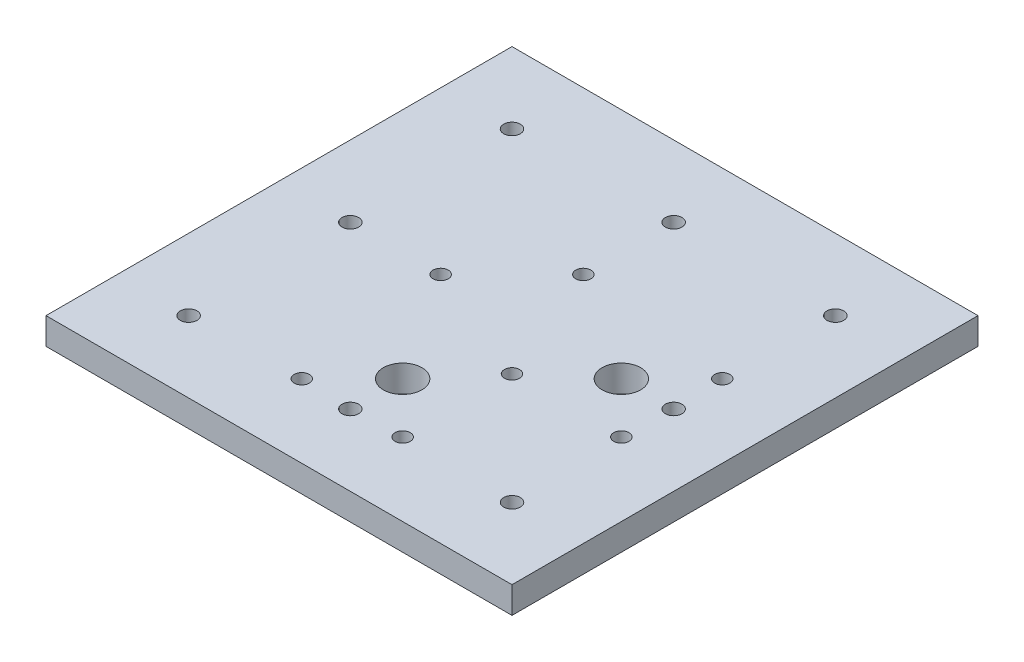
ISO-10303-21;
HEADER;
FILE_DESCRIPTION(('STEP AP214'),'2;1');
FILE_NAME('part.step','',(''),(''),'','','');
FILE_SCHEMA(('AUTOMOTIVE_DESIGN { 1 0 10303 214 1 1 1 1 }'));
ENDSEC;
DATA;
#1=APPLICATION_CONTEXT('core data for automotive mechanical design processes');
#2=APPLICATION_PROTOCOL_DEFINITION('international standard','automotive_design',2000,#1);
#3=PRODUCT_CONTEXT('',#1,'mechanical');
#4=PRODUCT('Part','Part','',(#3));
#5=PRODUCT_RELATED_PRODUCT_CATEGORY('part','',(#4));
#6=PRODUCT_DEFINITION_FORMATION('','',#4);
#7=PRODUCT_DEFINITION_CONTEXT('part definition',#1,'design');
#8=PRODUCT_DEFINITION('design','',#6,#7);
#9=PRODUCT_DEFINITION_SHAPE('','',#8);
#10=(LENGTH_UNIT() NAMED_UNIT(*) SI_UNIT(.MILLI.,.METRE.));
#11=(NAMED_UNIT(*) PLANE_ANGLE_UNIT() SI_UNIT($,.RADIAN.));
#12=(NAMED_UNIT(*) SI_UNIT($,.STERADIAN.) SOLID_ANGLE_UNIT());
#13=UNCERTAINTY_MEASURE_WITH_UNIT(LENGTH_MEASURE(1.E-05),#10,'distance_accuracy_value','');
#14=(GEOMETRIC_REPRESENTATION_CONTEXT(3) GLOBAL_UNCERTAINTY_ASSIGNED_CONTEXT((#13)) GLOBAL_UNIT_ASSIGNED_CONTEXT((#10,
#11,#12)) REPRESENTATION_CONTEXT('',''));
#15=CARTESIAN_POINT('',(0.,0.,0.));
#16=DIRECTION('',(0.,0.,1.));
#17=DIRECTION('',(1.,0.,0.));
#18=AXIS2_PLACEMENT_3D('',#15,#16,#17);
#19=CARTESIAN_POINT('',(0.,5.6,0.));
#20=DIRECTION('',(0.,-1.,0.));
#21=DIRECTION('',(0.,0.,-1.));
#22=AXIS2_PLACEMENT_3D('',#19,#20,#21);
#23=PLANE('',#22);
#24=CARTESIAN_POINT('',(49.,5.6,-26.));
#25=DIRECTION('',(0.,-1.,0.));
#26=DIRECTION('',(0.,0.,-1.));
#27=AXIS2_PLACEMENT_3D('',#24,#25,#26);
#28=CIRCLE('',#27,4.05);
#29=CARTESIAN_POINT('',(49.,5.6,-30.05));
#30=VERTEX_POINT('',#29);
#31=EDGE_CURVE('E113',#30,#30,#28,.T.);
#32=ORIENTED_EDGE('',*,*,#31,.T.);
#33=EDGE_LOOP('',(#32));
#34=FACE_BOUND('',#33,.T.);
#35=CARTESIAN_POINT('',(72.,5.6,-49.));
#36=DIRECTION('',(0.,-1.,0.));
#37=DIRECTION('',(0.,0.,1.));
#38=AXIS2_PLACEMENT_3D('',#35,#36,#37);
#39=CIRCLE('',#38,4.04999999999999);
#40=CARTESIAN_POINT('',(72.,5.6,-44.95));
#41=VERTEX_POINT('',#40);
#42=EDGE_CURVE('E438',#41,#41,#39,.T.);
#43=ORIENTED_EDGE('',*,*,#42,.T.);
#44=EDGE_LOOP('',(#43));
#45=FACE_BOUND('',#44,.T.);
#46=CARTESIAN_POINT('',(15.0000000000004,5.6,-49.));
#47=DIRECTION('',(0.,1.,0.));
#48=DIRECTION('',(0.,0.,1.));
#49=AXIS2_PLACEMENT_3D('',#46,#47,#48);
#50=CIRCLE('',#49,1.75);
#51=CARTESIAN_POINT('',(15.0000000000004,5.6,-47.25));
#52=VERTEX_POINT('',#51);
#53=EDGE_CURVE('E148',#52,#52,#50,.T.);
#54=ORIENTED_EDGE('',*,*,#53,.F.);
#55=EDGE_LOOP('',(#54));
#56=FACE_BOUND('',#55,.T.);
#57=CARTESIAN_POINT('',(49.0000000000007,5.6,-15.));
#58=DIRECTION('',(0.,1.,0.));
#59=DIRECTION('',(0.,0.,1.));
#60=AXIS2_PLACEMENT_3D('',#57,#58,#59);
#61=CIRCLE('',#60,1.75);
#62=CARTESIAN_POINT('',(49.0000000000007,5.6,-13.25));
#63=VERTEX_POINT('',#62);
#64=EDGE_CURVE('E160',#63,#63,#61,.T.);
#65=ORIENTED_EDGE('',*,*,#64,.F.);
#66=EDGE_LOOP('',(#65));
#67=FACE_BOUND('',#66,.T.);
#68=CARTESIAN_POINT('',(83.,5.6,-83.));
#69=DIRECTION('',(0.,1.,0.));
#70=DIRECTION('',(0.,0.,1.));
#71=AXIS2_PLACEMENT_3D('',#68,#69,#70);
#72=CIRCLE('',#71,1.75);
#73=CARTESIAN_POINT('',(83.,5.6,-81.25));
#74=VERTEX_POINT('',#73);
#75=EDGE_CURVE('E172',#74,#74,#72,.T.);
#76=ORIENTED_EDGE('',*,*,#75,.F.);
#77=EDGE_LOOP('',(#76));
#78=FACE_BOUND('',#77,.T.);
#79=CARTESIAN_POINT('',(15.,5.6,-83.));
#80=DIRECTION('',(0.,1.,0.));
#81=DIRECTION('',(0.,0.,1.));
#82=AXIS2_PLACEMENT_3D('',#79,#80,#81);
#83=CIRCLE('',#82,1.75);
#84=CARTESIAN_POINT('',(15.,5.6,-81.25));
#85=VERTEX_POINT('',#84);
#86=EDGE_CURVE('E103',#85,#85,#83,.T.);
#87=ORIENTED_EDGE('',*,*,#86,.F.);
#88=EDGE_LOOP('',(#87));
#89=FACE_BOUND('',#88,.T.);
#90=DIRECTION('',(0.,0.,1.));
#91=VECTOR('',#90,1.);
#92=CARTESIAN_POINT('',(0.,5.6,0.));
#93=LINE('',#92,#91);
#94=CARTESIAN_POINT('',(0.,5.6,-98.));
#95=VERTEX_POINT('',#94);
#96=CARTESIAN_POINT('',(0.,5.6,0.));
#97=VERTEX_POINT('',#96);
#98=EDGE_CURVE('E87',#95,#97,#93,.T.);
#99=ORIENTED_EDGE('',*,*,#98,.T.);
#100=DIRECTION('',(1.,0.,0.));
#101=VECTOR('',#100,1.);
#102=CARTESIAN_POINT('',(0.,5.6,0.));
#103=LINE('',#102,#101);
#104=CARTESIAN_POINT('',(98.,5.6,0.));
#105=VERTEX_POINT('',#104);
#106=EDGE_CURVE('E82',#97,#105,#103,.T.);
#107=ORIENTED_EDGE('',*,*,#106,.T.);
#108=DIRECTION('',(0.,0.,-1.));
#109=VECTOR('',#108,1.);
#110=CARTESIAN_POINT('',(98.,5.6,0.));
#111=LINE('',#110,#109);
#112=CARTESIAN_POINT('',(98.,5.6,-98.));
#113=VERTEX_POINT('',#112);
#114=EDGE_CURVE('E85',#105,#113,#111,.T.);
#115=ORIENTED_EDGE('',*,*,#114,.T.);
#116=DIRECTION('',(-1.,0.,0.));
#117=VECTOR('',#116,1.);
#118=CARTESIAN_POINT('',(0.,5.6,-98.));
#119=LINE('',#118,#117);
#120=EDGE_CURVE('E52',#113,#95,#119,.T.);
#121=ORIENTED_EDGE('',*,*,#120,.T.);
#122=EDGE_LOOP('',(#99,#107,#115,#121));
#123=FACE_BOUND('',#122,.T.);
#124=CARTESIAN_POINT('',(49.,5.6,-83.));
#125=DIRECTION('',(0.,1.,0.));
#126=DIRECTION('',(0.,0.,1.));
#127=AXIS2_PLACEMENT_3D('',#124,#125,#126);
#128=CIRCLE('',#127,1.75);
#129=CARTESIAN_POINT('',(49.,5.6,-81.25));
#130=VERTEX_POINT('',#129);
#131=EDGE_CURVE('E178',#130,#130,#128,.T.);
#132=ORIENTED_EDGE('',*,*,#131,.F.);
#133=EDGE_LOOP('',(#132));
#134=FACE_BOUND('',#133,.T.);
#135=CARTESIAN_POINT('',(83.0000000000004,5.6,-49.));
#136=DIRECTION('',(0.,1.,0.));
#137=DIRECTION('',(0.,0.,1.));
#138=AXIS2_PLACEMENT_3D('',#135,#136,#137);
#139=CIRCLE('',#138,1.75);
#140=CARTESIAN_POINT('',(83.0000000000004,5.6,-47.25));
#141=VERTEX_POINT('',#140);
#142=EDGE_CURVE('E166',#141,#141,#139,.T.);
#143=ORIENTED_EDGE('',*,*,#142,.F.);
#144=EDGE_LOOP('',(#143));
#145=FACE_BOUND('',#144,.T.);
#146=CARTESIAN_POINT('',(83.0000000000007,5.6,-15.));
#147=DIRECTION('',(0.,1.,0.));
#148=DIRECTION('',(0.,0.,1.));
#149=AXIS2_PLACEMENT_3D('',#146,#147,#148);
#150=CIRCLE('',#149,1.75);
#151=CARTESIAN_POINT('',(83.0000000000007,5.6,-13.25));
#152=VERTEX_POINT('',#151);
#153=EDGE_CURVE('E154',#152,#152,#150,.T.);
#154=ORIENTED_EDGE('',*,*,#153,.F.);
#155=EDGE_LOOP('',(#154));
#156=FACE_BOUND('',#155,.T.);
#157=CARTESIAN_POINT('',(15.0000000000007,5.6,-15.));
#158=DIRECTION('',(0.,1.,0.));
#159=DIRECTION('',(0.,0.,1.));
#160=AXIS2_PLACEMENT_3D('',#157,#158,#159);
#161=CIRCLE('',#160,1.75);
#162=CARTESIAN_POINT('',(15.0000000000007,5.6,-13.25));
#163=VERTEX_POINT('',#162);
#164=EDGE_CURVE('E139',#163,#163,#161,.T.);
#165=ORIENTED_EDGE('',*,*,#164,.F.);
#166=EDGE_LOOP('',(#165));
#167=FACE_BOUND('',#166,.T.);
#168=CARTESIAN_POINT('',(82.6066017177982,5.6,-59.6066017177982));
#169=DIRECTION('',(0.,-1.,0.));
#170=DIRECTION('',(0.,0.,1.));
#171=AXIS2_PLACEMENT_3D('',#168,#169,#170);
#172=CIRCLE('',#171,1.6);
#173=CARTESIAN_POINT('',(82.6066017177982,5.6,-58.0066017177982));
#174=VERTEX_POINT('',#173);
#175=EDGE_CURVE('E444',#174,#174,#172,.T.);
#176=ORIENTED_EDGE('',*,*,#175,.T.);
#177=EDGE_LOOP('',(#176));
#178=FACE_BOUND('',#177,.T.);
#179=CARTESIAN_POINT('',(82.6066017177982,5.6,-38.3933982822018));
#180=DIRECTION('',(0.,-1.,0.));
#181=DIRECTION('',(0.,0.,-1.));
#182=AXIS2_PLACEMENT_3D('',#179,#180,#181);
#183=CIRCLE('',#182,1.60000000000001);
#184=CARTESIAN_POINT('',(82.6066017177982,5.6,-39.9933982822018));
#185=VERTEX_POINT('',#184);
#186=EDGE_CURVE('E447',#185,#185,#183,.T.);
#187=ORIENTED_EDGE('',*,*,#186,.T.);
#188=EDGE_LOOP('',(#187));
#189=FACE_BOUND('',#188,.T.);
#190=CARTESIAN_POINT('',(34.,5.6,-49.));
#191=DIRECTION('',(0.,-1.,0.));
#192=DIRECTION('',(0.,0.,-1.));
#193=AXIS2_PLACEMENT_3D('',#190,#191,#192);
#194=CIRCLE('',#193,1.6);
#195=CARTESIAN_POINT('',(34.,5.6,-50.6));
#196=VERTEX_POINT('',#195);
#197=EDGE_CURVE('E435',#196,#196,#194,.T.);
#198=ORIENTED_EDGE('',*,*,#197,.T.);
#199=EDGE_LOOP('',(#198));
#200=FACE_BOUND('',#199,.T.);
#201=CARTESIAN_POINT('',(38.3933982822018,5.6,-15.3933982822018));
#202=DIRECTION('',(0.,-1.,0.));
#203=DIRECTION('',(0.,0.,-1.));
#204=AXIS2_PLACEMENT_3D('',#201,#202,#203);
#205=CIRCLE('',#204,1.6);
#206=CARTESIAN_POINT('',(38.3933982822018,5.6,-16.9933982822018));
#207=VERTEX_POINT('',#206);
#208=EDGE_CURVE('E427',#207,#207,#205,.T.);
#209=ORIENTED_EDGE('',*,*,#208,.T.);
#210=EDGE_LOOP('',(#209));
#211=FACE_BOUND('',#210,.T.);
#212=CARTESIAN_POINT('',(59.6066017177982,5.6,-15.3933982822018));
#213=DIRECTION('',(0.,-1.,0.));
#214=DIRECTION('',(0.,0.,1.));
#215=AXIS2_PLACEMENT_3D('',#212,#213,#214);
#216=CIRCLE('',#215,1.6);
#217=CARTESIAN_POINT('',(59.6066017177982,5.6,-13.7933982822018));
#218=VERTEX_POINT('',#217);
#219=EDGE_CURVE('E430',#218,#218,#216,.T.);
#220=ORIENTED_EDGE('',*,*,#219,.T.);
#221=EDGE_LOOP('',(#220));
#222=FACE_BOUND('',#221,.T.);
#223=CARTESIAN_POINT('',(59.6066017177982,5.6,-38.3933982822018));
#224=DIRECTION('',(0.,-1.,0.));
#225=DIRECTION('',(0.,0.,-1.));
#226=AXIS2_PLACEMENT_3D('',#223,#224,#225);
#227=CIRCLE('',#226,1.6);
#228=CARTESIAN_POINT('',(59.6066017177982,5.6,-39.9933982822018));
#229=VERTEX_POINT('',#228);
#230=EDGE_CURVE('E449',#229,#229,#227,.T.);
#231=ORIENTED_EDGE('',*,*,#230,.T.);
#232=EDGE_LOOP('',(#231));
#233=FACE_BOUND('',#232,.T.);
#234=CARTESIAN_POINT('',(49.,5.6,-64.));
#235=DIRECTION('',(0.,-1.,0.));
#236=DIRECTION('',(0.,0.,1.));
#237=AXIS2_PLACEMENT_3D('',#234,#235,#236);
#238=CIRCLE('',#237,1.59999999999998);
#239=CARTESIAN_POINT('',(49.,5.6,-62.4));
#240=VERTEX_POINT('',#239);
#241=EDGE_CURVE('E441',#240,#240,#238,.T.);
#242=ORIENTED_EDGE('',*,*,#241,.T.);
#243=EDGE_LOOP('',(#242));
#244=FACE_BOUND('',#243,.T.);
#245=ADVANCED_FACE('F33',(#34,#45,#56,#67,#78,#89,#123,#134,#145,#156,#167,#178,#189,#200,#211,
#222,#233,#244),#23,.F.);
#246=CARTESIAN_POINT('',(0.,0.,0.));
#247=DIRECTION('',(0.,-1.,0.));
#248=DIRECTION('',(0.,0.,-1.));
#249=AXIS2_PLACEMENT_3D('',#246,#247,#248);
#250=PLANE('',#249);
#251=CARTESIAN_POINT('',(49.,0.,-26.));
#252=DIRECTION('',(0.,-1.,0.));
#253=DIRECTION('',(0.,0.,-1.));
#254=AXIS2_PLACEMENT_3D('',#251,#252,#253);
#255=CIRCLE('',#254,4.05);
#256=CARTESIAN_POINT('',(49.,0.,-30.05));
#257=VERTEX_POINT('',#256);
#258=EDGE_CURVE('E37',#257,#257,#255,.T.);
#259=ORIENTED_EDGE('',*,*,#258,.F.);
#260=EDGE_LOOP('',(#259));
#261=FACE_BOUND('',#260,.T.);
#262=CARTESIAN_POINT('',(38.3933982822018,0.,-15.3933982822018));
#263=DIRECTION('',(0.,-1.,0.));
#264=DIRECTION('',(0.,0.,-1.));
#265=AXIS2_PLACEMENT_3D('',#262,#263,#264);
#266=CIRCLE('',#265,1.6);
#267=CARTESIAN_POINT('',(38.3933982822018,0.,-16.9933982822018));
#268=VERTEX_POINT('',#267);
#269=EDGE_CURVE('E130',#268,#268,#266,.T.);
#270=ORIENTED_EDGE('',*,*,#269,.F.);
#271=EDGE_LOOP('',(#270));
#272=FACE_BOUND('',#271,.T.);
#273=CARTESIAN_POINT('',(59.6066017177982,0.,-15.3933982822018));
#274=DIRECTION('',(0.,-1.,0.));
#275=DIRECTION('',(0.,0.,-1.));
#276=AXIS2_PLACEMENT_3D('',#273,#274,#275);
#277=CIRCLE('',#276,1.6);
#278=CARTESIAN_POINT('',(59.6066017177982,0.,-16.9933982822018));
#279=VERTEX_POINT('',#278);
#280=EDGE_CURVE('E128',#279,#279,#277,.T.);
#281=ORIENTED_EDGE('',*,*,#280,.F.);
#282=EDGE_LOOP('',(#281));
#283=FACE_BOUND('',#282,.T.);
#284=CARTESIAN_POINT('',(34.,0.,-49.));
#285=DIRECTION('',(0.,-1.,0.));
#286=DIRECTION('',(0.,0.,-1.));
#287=AXIS2_PLACEMENT_3D('',#284,#285,#286);
#288=CIRCLE('',#287,1.6);
#289=CARTESIAN_POINT('',(34.,0.,-50.6));
#290=VERTEX_POINT('',#289);
#291=EDGE_CURVE('E125',#290,#290,#288,.T.);
#292=ORIENTED_EDGE('',*,*,#291,.F.);
#293=EDGE_LOOP('',(#292));
#294=FACE_BOUND('',#293,.T.);
#295=CARTESIAN_POINT('',(72.,0.,-49.));
#296=DIRECTION('',(0.,-1.,0.));
#297=DIRECTION('',(0.,0.,-1.));
#298=AXIS2_PLACEMENT_3D('',#295,#296,#297);
#299=CIRCLE('',#298,4.04999999999999);
#300=CARTESIAN_POINT('',(72.,0.,-53.05));
#301=VERTEX_POINT('',#300);
#302=EDGE_CURVE('E122',#301,#301,#299,.T.);
#303=ORIENTED_EDGE('',*,*,#302,.F.);
#304=EDGE_LOOP('',(#303));
#305=FACE_BOUND('',#304,.T.);
#306=CARTESIAN_POINT('',(49.,0.,-64.));
#307=DIRECTION('',(0.,-1.,0.));
#308=DIRECTION('',(0.,0.,-1.));
#309=AXIS2_PLACEMENT_3D('',#306,#307,#308);
#310=CIRCLE('',#309,1.59999999999998);
#311=CARTESIAN_POINT('',(49.,0.,-65.6));
#312=VERTEX_POINT('',#311);
#313=EDGE_CURVE('E119',#312,#312,#310,.T.);
#314=ORIENTED_EDGE('',*,*,#313,.F.);
#315=EDGE_LOOP('',(#314));
#316=FACE_BOUND('',#315,.T.);
#317=CARTESIAN_POINT('',(82.6066017177982,0.,-59.6066017177982));
#318=DIRECTION('',(0.,-1.,0.));
#319=DIRECTION('',(0.,0.,-1.));
#320=AXIS2_PLACEMENT_3D('',#317,#318,#319);
#321=CIRCLE('',#320,1.6);
#322=CARTESIAN_POINT('',(82.6066017177982,0.,-61.2066017177982));
#323=VERTEX_POINT('',#322);
#324=EDGE_CURVE('E116',#323,#323,#321,.T.);
#325=ORIENTED_EDGE('',*,*,#324,.F.);
#326=EDGE_LOOP('',(#325));
#327=FACE_BOUND('',#326,.T.);
#328=CARTESIAN_POINT('',(82.6066017177982,0.,-38.3933982822018));
#329=DIRECTION('',(0.,-1.,0.));
#330=DIRECTION('',(0.,0.,-1.));
#331=AXIS2_PLACEMENT_3D('',#328,#329,#330);
#332=CIRCLE('',#331,1.60000000000001);
#333=CARTESIAN_POINT('',(82.6066017177982,0.,-39.9933982822018));
#334=VERTEX_POINT('',#333);
#335=EDGE_CURVE('E112',#334,#334,#332,.T.);
#336=ORIENTED_EDGE('',*,*,#335,.F.);
#337=EDGE_LOOP('',(#336));
#338=FACE_BOUND('',#337,.T.);
#339=CARTESIAN_POINT('',(59.6066017177982,0.,-38.3933982822018));
#340=DIRECTION('',(0.,-1.,0.));
#341=DIRECTION('',(0.,0.,-1.));
#342=AXIS2_PLACEMENT_3D('',#339,#340,#341);
#343=CIRCLE('',#342,1.6);
#344=CARTESIAN_POINT('',(59.6066017177982,0.,-39.9933982822018));
#345=VERTEX_POINT('',#344);
#346=EDGE_CURVE('E109',#345,#345,#343,.T.);
#347=ORIENTED_EDGE('',*,*,#346,.F.);
#348=EDGE_LOOP('',(#347));
#349=FACE_BOUND('',#348,.T.);
#350=CARTESIAN_POINT('',(15.0000000000004,0.,-49.));
#351=DIRECTION('',(0.,1.,0.));
#352=DIRECTION('',(0.,0.,1.));
#353=AXIS2_PLACEMENT_3D('',#350,#351,#352);
#354=CIRCLE('',#353,1.75);
#355=CARTESIAN_POINT('',(15.0000000000004,0.,-47.25));
#356=VERTEX_POINT('',#355);
#357=EDGE_CURVE('E144',#356,#356,#354,.T.);
#358=ORIENTED_EDGE('',*,*,#357,.T.);
#359=EDGE_LOOP('',(#358));
#360=FACE_BOUND('',#359,.T.);
#361=CARTESIAN_POINT('',(49.0000000000007,0.,-15.));
#362=DIRECTION('',(0.,1.,0.));
#363=DIRECTION('',(0.,0.,1.));
#364=AXIS2_PLACEMENT_3D('',#361,#362,#363);
#365=CIRCLE('',#364,1.75);
#366=CARTESIAN_POINT('',(49.0000000000007,0.,-13.25));
#367=VERTEX_POINT('',#366);
#368=EDGE_CURVE('E157',#367,#367,#365,.T.);
#369=ORIENTED_EDGE('',*,*,#368,.T.);
#370=EDGE_LOOP('',(#369));
#371=FACE_BOUND('',#370,.T.);
#372=CARTESIAN_POINT('',(83.,0.,-83.));
#373=DIRECTION('',(0.,1.,0.));
#374=DIRECTION('',(0.,0.,1.));
#375=AXIS2_PLACEMENT_3D('',#372,#373,#374);
#376=CIRCLE('',#375,1.75);
#377=CARTESIAN_POINT('',(83.,0.,-81.25));
#378=VERTEX_POINT('',#377);
#379=EDGE_CURVE('E169',#378,#378,#376,.T.);
#380=ORIENTED_EDGE('',*,*,#379,.T.);
#381=EDGE_LOOP('',(#380));
#382=FACE_BOUND('',#381,.T.);
#383=CARTESIAN_POINT('',(15.,0.,-83.));
#384=DIRECTION('',(0.,1.,0.));
#385=DIRECTION('',(0.,0.,1.));
#386=AXIS2_PLACEMENT_3D('',#383,#384,#385);
#387=CIRCLE('',#386,1.75);
#388=CARTESIAN_POINT('',(15.,0.,-81.25));
#389=VERTEX_POINT('',#388);
#390=EDGE_CURVE('E181',#389,#389,#387,.T.);
#391=ORIENTED_EDGE('',*,*,#390,.T.);
#392=EDGE_LOOP('',(#391));
#393=FACE_BOUND('',#392,.T.);
#394=DIRECTION('',(0.,0.,1.));
#395=VECTOR('',#394,1.);
#396=CARTESIAN_POINT('',(0.,0.,0.));
#397=LINE('',#396,#395);
#398=CARTESIAN_POINT('',(0.,0.,-98.));
#399=VERTEX_POINT('',#398);
#400=CARTESIAN_POINT('',(0.,0.,0.));
#401=VERTEX_POINT('',#400);
#402=EDGE_CURVE('E100',#399,#401,#397,.T.);
#403=ORIENTED_EDGE('',*,*,#402,.F.);
#404=DIRECTION('',(-1.,0.,0.));
#405=VECTOR('',#404,1.);
#406=CARTESIAN_POINT('',(0.,0.,-98.));
#407=LINE('',#406,#405);
#408=CARTESIAN_POINT('',(98.,0.,-98.));
#409=VERTEX_POINT('',#408);
#410=EDGE_CURVE('E75',#409,#399,#407,.T.);
#411=ORIENTED_EDGE('',*,*,#410,.F.);
#412=DIRECTION('',(0.,0.,-1.));
#413=VECTOR('',#412,1.);
#414=CARTESIAN_POINT('',(98.,0.,0.));
#415=LINE('',#414,#413);
#416=CARTESIAN_POINT('',(98.,0.,0.));
#417=VERTEX_POINT('',#416);
#418=EDGE_CURVE('E69',#417,#409,#415,.T.);
#419=ORIENTED_EDGE('',*,*,#418,.F.);
#420=DIRECTION('',(1.,0.,0.));
#421=VECTOR('',#420,1.);
#422=CARTESIAN_POINT('',(0.,0.,0.));
#423=LINE('',#422,#421);
#424=EDGE_CURVE('E91',#401,#417,#423,.T.);
#425=ORIENTED_EDGE('',*,*,#424,.F.);
#426=EDGE_LOOP('',(#403,#411,#419,#425));
#427=FACE_BOUND('',#426,.T.);
#428=CARTESIAN_POINT('',(49.,0.,-83.));
#429=DIRECTION('',(0.,1.,0.));
#430=DIRECTION('',(0.,0.,1.));
#431=AXIS2_PLACEMENT_3D('',#428,#429,#430);
#432=CIRCLE('',#431,1.75);
#433=CARTESIAN_POINT('',(49.,0.,-81.25));
#434=VERTEX_POINT('',#433);
#435=EDGE_CURVE('E175',#434,#434,#432,.T.);
#436=ORIENTED_EDGE('',*,*,#435,.T.);
#437=EDGE_LOOP('',(#436));
#438=FACE_BOUND('',#437,.T.);
#439=CARTESIAN_POINT('',(83.0000000000004,0.,-49.));
#440=DIRECTION('',(0.,1.,0.));
#441=DIRECTION('',(0.,0.,1.));
#442=AXIS2_PLACEMENT_3D('',#439,#440,#441);
#443=CIRCLE('',#442,1.75);
#444=CARTESIAN_POINT('',(83.0000000000004,0.,-47.25));
#445=VERTEX_POINT('',#444);
#446=EDGE_CURVE('E163',#445,#445,#443,.T.);
#447=ORIENTED_EDGE('',*,*,#446,.T.);
#448=EDGE_LOOP('',(#447));
#449=FACE_BOUND('',#448,.T.);
#450=CARTESIAN_POINT('',(83.0000000000007,0.,-15.));
#451=DIRECTION('',(0.,1.,0.));
#452=DIRECTION('',(0.,0.,1.));
#453=AXIS2_PLACEMENT_3D('',#450,#451,#452);
#454=CIRCLE('',#453,1.75);
#455=CARTESIAN_POINT('',(83.0000000000007,0.,-13.25));
#456=VERTEX_POINT('',#455);
#457=EDGE_CURVE('E151',#456,#456,#454,.T.);
#458=ORIENTED_EDGE('',*,*,#457,.T.);
#459=EDGE_LOOP('',(#458));
#460=FACE_BOUND('',#459,.T.);
#461=CARTESIAN_POINT('',(15.0000000000007,0.,-15.));
#462=DIRECTION('',(0.,1.,0.));
#463=DIRECTION('',(0.,0.,1.));
#464=AXIS2_PLACEMENT_3D('',#461,#462,#463);
#465=CIRCLE('',#464,1.75);
#466=CARTESIAN_POINT('',(15.0000000000007,0.,-13.25));
#467=VERTEX_POINT('',#466);
#468=EDGE_CURVE('E135',#467,#467,#465,.T.);
#469=ORIENTED_EDGE('',*,*,#468,.T.);
#470=EDGE_LOOP('',(#469));
#471=FACE_BOUND('',#470,.T.);
#472=ADVANCED_FACE('F189',(#261,#272,#283,#294,#305,#316,#327,#338,#349,#360,#371,#382,#393,
#427,#438,#449,#460,#471),#250,.T.);
#473=CARTESIAN_POINT('',(0.,5.6,0.));
#474=DIRECTION('',(1.,0.,0.));
#475=DIRECTION('',(0.,0.,-1.));
#476=AXIS2_PLACEMENT_3D('',#473,#474,#475);
#477=PLANE('',#476);
#478=ORIENTED_EDGE('',*,*,#402,.T.);
#479=DIRECTION('',(0.,-1.,0.));
#480=VECTOR('',#479,1.);
#481=CARTESIAN_POINT('',(0.,5.6,0.));
#482=LINE('',#481,#480);
#483=EDGE_CURVE('E11',#97,#401,#482,.T.);
#484=ORIENTED_EDGE('',*,*,#483,.F.);
#485=ORIENTED_EDGE('',*,*,#98,.F.);
#486=DIRECTION('',(0.,-1.,0.));
#487=VECTOR('',#486,1.);
#488=CARTESIAN_POINT('',(0.,5.6,-98.));
#489=LINE('',#488,#487);
#490=EDGE_CURVE('E96',#95,#399,#489,.T.);
#491=ORIENTED_EDGE('',*,*,#490,.T.);
#492=EDGE_LOOP('',(#478,#484,#485,#491));
#493=FACE_BOUND('',#492,.T.);
#494=ADVANCED_FACE('F35',(#493),#477,.F.);
#495=CARTESIAN_POINT('',(0.,5.6,0.));
#496=DIRECTION('',(0.,0.,-1.));
#497=DIRECTION('',(-1.,0.,0.));
#498=AXIS2_PLACEMENT_3D('',#495,#496,#497);
#499=PLANE('',#498);
#500=ORIENTED_EDGE('',*,*,#424,.T.);
#501=DIRECTION('',(0.,-1.,0.));
#502=VECTOR('',#501,1.);
#503=CARTESIAN_POINT('',(98.,5.6,0.));
#504=LINE('',#503,#502);
#505=EDGE_CURVE('E43',#105,#417,#504,.T.);
#506=ORIENTED_EDGE('',*,*,#505,.F.);
#507=ORIENTED_EDGE('',*,*,#106,.F.);
#508=ORIENTED_EDGE('',*,*,#483,.T.);
#509=EDGE_LOOP('',(#500,#506,#507,#508));
#510=FACE_BOUND('',#509,.T.);
#511=ADVANCED_FACE('F90',(#510),#499,.F.);
#512=CARTESIAN_POINT('',(98.,5.6,0.));
#513=DIRECTION('',(-1.,0.,0.));
#514=DIRECTION('',(0.,0.,1.));
#515=AXIS2_PLACEMENT_3D('',#512,#513,#514);
#516=PLANE('',#515);
#517=ORIENTED_EDGE('',*,*,#418,.T.);
#518=DIRECTION('',(0.,-1.,0.));
#519=VECTOR('',#518,1.);
#520=CARTESIAN_POINT('',(98.,5.6,-98.));
#521=LINE('',#520,#519);
#522=EDGE_CURVE('E92',#113,#409,#521,.T.);
#523=ORIENTED_EDGE('',*,*,#522,.F.);
#524=ORIENTED_EDGE('',*,*,#114,.F.);
#525=ORIENTED_EDGE('',*,*,#505,.T.);
#526=EDGE_LOOP('',(#517,#523,#524,#525));
#527=FACE_BOUND('',#526,.T.);
#528=ADVANCED_FACE('F94',(#527),#516,.F.);
#529=CARTESIAN_POINT('',(0.,5.6,-98.));
#530=DIRECTION('',(0.,0.,1.));
#531=DIRECTION('',(1.,0.,0.));
#532=AXIS2_PLACEMENT_3D('',#529,#530,#531);
#533=PLANE('',#532);
#534=ORIENTED_EDGE('',*,*,#410,.T.);
#535=ORIENTED_EDGE('',*,*,#490,.F.);
#536=ORIENTED_EDGE('',*,*,#120,.F.);
#537=ORIENTED_EDGE('',*,*,#522,.T.);
#538=EDGE_LOOP('',(#534,#535,#536,#537));
#539=FACE_BOUND('',#538,.T.);
#540=ADVANCED_FACE('F195',(#539),#533,.F.);
#541=CARTESIAN_POINT('',(15.,5.6,-83.));
#542=DIRECTION('',(0.,-1.,0.));
#543=DIRECTION('',(0.,0.,-1.));
#544=AXIS2_PLACEMENT_3D('',#541,#542,#543);
#545=CYLINDRICAL_SURFACE('',#544,1.75);
#546=ORIENTED_EDGE('',*,*,#86,.T.);
#547=EDGE_LOOP('',(#546));
#548=FACE_BOUND('',#547,.T.);
#549=ORIENTED_EDGE('',*,*,#390,.F.);
#550=EDGE_LOOP('',(#549));
#551=FACE_BOUND('',#550,.T.);
#552=ADVANCED_FACE('F192',(#548,#551),#545,.F.);
#553=CARTESIAN_POINT('',(49.,5.6,-83.));
#554=DIRECTION('',(0.,-1.,0.));
#555=DIRECTION('',(0.,0.,-1.));
#556=AXIS2_PLACEMENT_3D('',#553,#554,#555);
#557=CYLINDRICAL_SURFACE('',#556,1.75);
#558=ORIENTED_EDGE('',*,*,#131,.T.);
#559=EDGE_LOOP('',(#558));
#560=FACE_BOUND('',#559,.T.);
#561=ORIENTED_EDGE('',*,*,#435,.F.);
#562=EDGE_LOOP('',(#561));
#563=FACE_BOUND('',#562,.T.);
#564=ADVANCED_FACE('F194',(#560,#563),#557,.F.);
#565=CARTESIAN_POINT('',(83.,5.6,-83.));
#566=DIRECTION('',(0.,-1.,0.));
#567=DIRECTION('',(0.,0.,-1.));
#568=AXIS2_PLACEMENT_3D('',#565,#566,#567);
#569=CYLINDRICAL_SURFACE('',#568,1.75);
#570=ORIENTED_EDGE('',*,*,#75,.T.);
#571=EDGE_LOOP('',(#570));
#572=FACE_BOUND('',#571,.T.);
#573=ORIENTED_EDGE('',*,*,#379,.F.);
#574=EDGE_LOOP('',(#573));
#575=FACE_BOUND('',#574,.T.);
#576=ADVANCED_FACE('F202',(#572,#575),#569,.F.);
#577=CARTESIAN_POINT('',(83.0000000000004,5.6,-49.));
#578=DIRECTION('',(0.,-1.,0.));
#579=DIRECTION('',(0.,0.,-1.));
#580=AXIS2_PLACEMENT_3D('',#577,#578,#579);
#581=CYLINDRICAL_SURFACE('',#580,1.75);
#582=ORIENTED_EDGE('',*,*,#142,.T.);
#583=EDGE_LOOP('',(#582));
#584=FACE_BOUND('',#583,.T.);
#585=ORIENTED_EDGE('',*,*,#446,.F.);
#586=EDGE_LOOP('',(#585));
#587=FACE_BOUND('',#586,.T.);
#588=ADVANCED_FACE('F246',(#584,#587),#581,.F.);
#589=CARTESIAN_POINT('',(49.0000000000007,5.6,-15.));
#590=DIRECTION('',(0.,-1.,0.));
#591=DIRECTION('',(0.,0.,-1.));
#592=AXIS2_PLACEMENT_3D('',#589,#590,#591);
#593=CYLINDRICAL_SURFACE('',#592,1.75);
#594=ORIENTED_EDGE('',*,*,#64,.T.);
#595=EDGE_LOOP('',(#594));
#596=FACE_BOUND('',#595,.T.);
#597=ORIENTED_EDGE('',*,*,#368,.F.);
#598=EDGE_LOOP('',(#597));
#599=FACE_BOUND('',#598,.T.);
#600=ADVANCED_FACE('F236',(#596,#599),#593,.F.);
#601=CARTESIAN_POINT('',(83.0000000000007,5.6,-15.));
#602=DIRECTION('',(0.,-1.,0.));
#603=DIRECTION('',(0.,0.,-1.));
#604=AXIS2_PLACEMENT_3D('',#601,#602,#603);
#605=CYLINDRICAL_SURFACE('',#604,1.75);
#606=ORIENTED_EDGE('',*,*,#153,.T.);
#607=EDGE_LOOP('',(#606));
#608=FACE_BOUND('',#607,.T.);
#609=ORIENTED_EDGE('',*,*,#457,.F.);
#610=EDGE_LOOP('',(#609));
#611=FACE_BOUND('',#610,.T.);
#612=ADVANCED_FACE('F233',(#608,#611),#605,.F.);
#613=CARTESIAN_POINT('',(15.0000000000004,5.6,-49.));
#614=DIRECTION('',(0.,-1.,0.));
#615=DIRECTION('',(0.,0.,-1.));
#616=AXIS2_PLACEMENT_3D('',#613,#614,#615);
#617=CYLINDRICAL_SURFACE('',#616,1.75);
#618=ORIENTED_EDGE('',*,*,#53,.T.);
#619=EDGE_LOOP('',(#618));
#620=FACE_BOUND('',#619,.T.);
#621=ORIENTED_EDGE('',*,*,#357,.F.);
#622=EDGE_LOOP('',(#621));
#623=FACE_BOUND('',#622,.T.);
#624=ADVANCED_FACE('F235',(#620,#623),#617,.F.);
#625=CARTESIAN_POINT('',(15.0000000000007,5.6,-15.));
#626=DIRECTION('',(0.,-1.,0.));
#627=DIRECTION('',(0.,0.,-1.));
#628=AXIS2_PLACEMENT_3D('',#625,#626,#627);
#629=CYLINDRICAL_SURFACE('',#628,1.75);
#630=ORIENTED_EDGE('',*,*,#164,.T.);
#631=EDGE_LOOP('',(#630));
#632=FACE_BOUND('',#631,.T.);
#633=ORIENTED_EDGE('',*,*,#468,.F.);
#634=EDGE_LOOP('',(#633));
#635=FACE_BOUND('',#634,.T.);
#636=ADVANCED_FACE('F243',(#632,#635),#629,.F.);
#637=CARTESIAN_POINT('',(59.6066017177982,5.6,-38.3933982822018));
#638=DIRECTION('',(0.,-1.,0.));
#639=DIRECTION('',(0.,0.,-1.));
#640=AXIS2_PLACEMENT_3D('',#637,#638,#639);
#641=CYLINDRICAL_SURFACE('',#640,1.6);
#642=ORIENTED_EDGE('',*,*,#346,.T.);
#643=EDGE_LOOP('',(#642));
#644=FACE_BOUND('',#643,.T.);
#645=ORIENTED_EDGE('',*,*,#230,.F.);
#646=EDGE_LOOP('',(#645));
#647=FACE_BOUND('',#646,.T.);
#648=ADVANCED_FACE('F298',(#644,#647),#641,.F.);
#649=CARTESIAN_POINT('',(82.6066017177982,5.6,-38.3933982822018));
#650=DIRECTION('',(0.,-1.,0.));
#651=DIRECTION('',(0.,0.,-1.));
#652=AXIS2_PLACEMENT_3D('',#649,#650,#651);
#653=CYLINDRICAL_SURFACE('',#652,1.60000000000001);
#654=ORIENTED_EDGE('',*,*,#335,.T.);
#655=EDGE_LOOP('',(#654));
#656=FACE_BOUND('',#655,.T.);
#657=ORIENTED_EDGE('',*,*,#186,.F.);
#658=EDGE_LOOP('',(#657));
#659=FACE_BOUND('',#658,.T.);
#660=ADVANCED_FACE('F307',(#656,#659),#653,.F.);
#661=CARTESIAN_POINT('',(82.6066017177982,5.6,-59.6066017177982));
#662=DIRECTION('',(0.,-1.,0.));
#663=DIRECTION('',(0.,0.,-1.));
#664=AXIS2_PLACEMENT_3D('',#661,#662,#663);
#665=CYLINDRICAL_SURFACE('',#664,1.6);
#666=ORIENTED_EDGE('',*,*,#324,.T.);
#667=EDGE_LOOP('',(#666));
#668=FACE_BOUND('',#667,.T.);
#669=ORIENTED_EDGE('',*,*,#175,.F.);
#670=EDGE_LOOP('',(#669));
#671=FACE_BOUND('',#670,.T.);
#672=ADVANCED_FACE('F317',(#668,#671),#665,.F.);
#673=CARTESIAN_POINT('',(49.,5.6,-64.));
#674=DIRECTION('',(0.,-1.,0.));
#675=DIRECTION('',(0.,0.,-1.));
#676=AXIS2_PLACEMENT_3D('',#673,#674,#675);
#677=CYLINDRICAL_SURFACE('',#676,1.59999999999998);
#678=ORIENTED_EDGE('',*,*,#313,.T.);
#679=EDGE_LOOP('',(#678));
#680=FACE_BOUND('',#679,.T.);
#681=ORIENTED_EDGE('',*,*,#241,.F.);
#682=EDGE_LOOP('',(#681));
#683=FACE_BOUND('',#682,.T.);
#684=ADVANCED_FACE('F327',(#680,#683),#677,.F.);
#685=CARTESIAN_POINT('',(72.,5.6,-49.));
#686=DIRECTION('',(0.,-1.,0.));
#687=DIRECTION('',(0.,0.,-1.));
#688=AXIS2_PLACEMENT_3D('',#685,#686,#687);
#689=CYLINDRICAL_SURFACE('',#688,4.04999999999999);
#690=ORIENTED_EDGE('',*,*,#302,.T.);
#691=EDGE_LOOP('',(#690));
#692=FACE_BOUND('',#691,.T.);
#693=ORIENTED_EDGE('',*,*,#42,.F.);
#694=EDGE_LOOP('',(#693));
#695=FACE_BOUND('',#694,.T.);
#696=ADVANCED_FACE('F337',(#692,#695),#689,.F.);
#697=CARTESIAN_POINT('',(34.,5.6,-49.));
#698=DIRECTION('',(0.,-1.,0.));
#699=DIRECTION('',(0.,0.,-1.));
#700=AXIS2_PLACEMENT_3D('',#697,#698,#699);
#701=CYLINDRICAL_SURFACE('',#700,1.6);
#702=ORIENTED_EDGE('',*,*,#291,.T.);
#703=EDGE_LOOP('',(#702));
#704=FACE_BOUND('',#703,.T.);
#705=ORIENTED_EDGE('',*,*,#197,.F.);
#706=EDGE_LOOP('',(#705));
#707=FACE_BOUND('',#706,.T.);
#708=ADVANCED_FACE('F347',(#704,#707),#701,.F.);
#709=CARTESIAN_POINT('',(59.6066017177982,5.6,-15.3933982822018));
#710=DIRECTION('',(0.,-1.,0.));
#711=DIRECTION('',(0.,0.,-1.));
#712=AXIS2_PLACEMENT_3D('',#709,#710,#711);
#713=CYLINDRICAL_SURFACE('',#712,1.6);
#714=ORIENTED_EDGE('',*,*,#280,.T.);
#715=EDGE_LOOP('',(#714));
#716=FACE_BOUND('',#715,.T.);
#717=ORIENTED_EDGE('',*,*,#219,.F.);
#718=EDGE_LOOP('',(#717));
#719=FACE_BOUND('',#718,.T.);
#720=ADVANCED_FACE('F357',(#716,#719),#713,.F.);
#721=CARTESIAN_POINT('',(38.3933982822018,5.6,-15.3933982822018));
#722=DIRECTION('',(0.,-1.,0.));
#723=DIRECTION('',(0.,0.,-1.));
#724=AXIS2_PLACEMENT_3D('',#721,#722,#723);
#725=CYLINDRICAL_SURFACE('',#724,1.6);
#726=ORIENTED_EDGE('',*,*,#269,.T.);
#727=EDGE_LOOP('',(#726));
#728=FACE_BOUND('',#727,.T.);
#729=ORIENTED_EDGE('',*,*,#208,.F.);
#730=EDGE_LOOP('',(#729));
#731=FACE_BOUND('',#730,.T.);
#732=ADVANCED_FACE('F367',(#728,#731),#725,.F.);
#733=CARTESIAN_POINT('',(49.,5.6,-26.));
#734=DIRECTION('',(0.,-1.,0.));
#735=DIRECTION('',(0.,0.,-1.));
#736=AXIS2_PLACEMENT_3D('',#733,#734,#735);
#737=CYLINDRICAL_SURFACE('',#736,4.05);
#738=ORIENTED_EDGE('',*,*,#258,.T.);
#739=EDGE_LOOP('',(#738));
#740=FACE_BOUND('',#739,.T.);
#741=ORIENTED_EDGE('',*,*,#31,.F.);
#742=EDGE_LOOP('',(#741));
#743=FACE_BOUND('',#742,.T.);
#744=ADVANCED_FACE('F377',(#740,#743),#737,.F.);
#745=CLOSED_SHELL('',(#245,#472,#494,#511,#528,#540,#552,#564,#576,#588,#600,#612,#624,#636,
#648,#660,#672,#684,#696,#708,#720,#732,#744));
#746=MANIFOLD_SOLID_BREP('B2',#745);
#747=ADVANCED_BREP_SHAPE_REPRESENTATION('',(#18,#746),#14);
#748=SHAPE_DEFINITION_REPRESENTATION(#9,#747);
ENDSEC;
END-ISO-10303-21;
